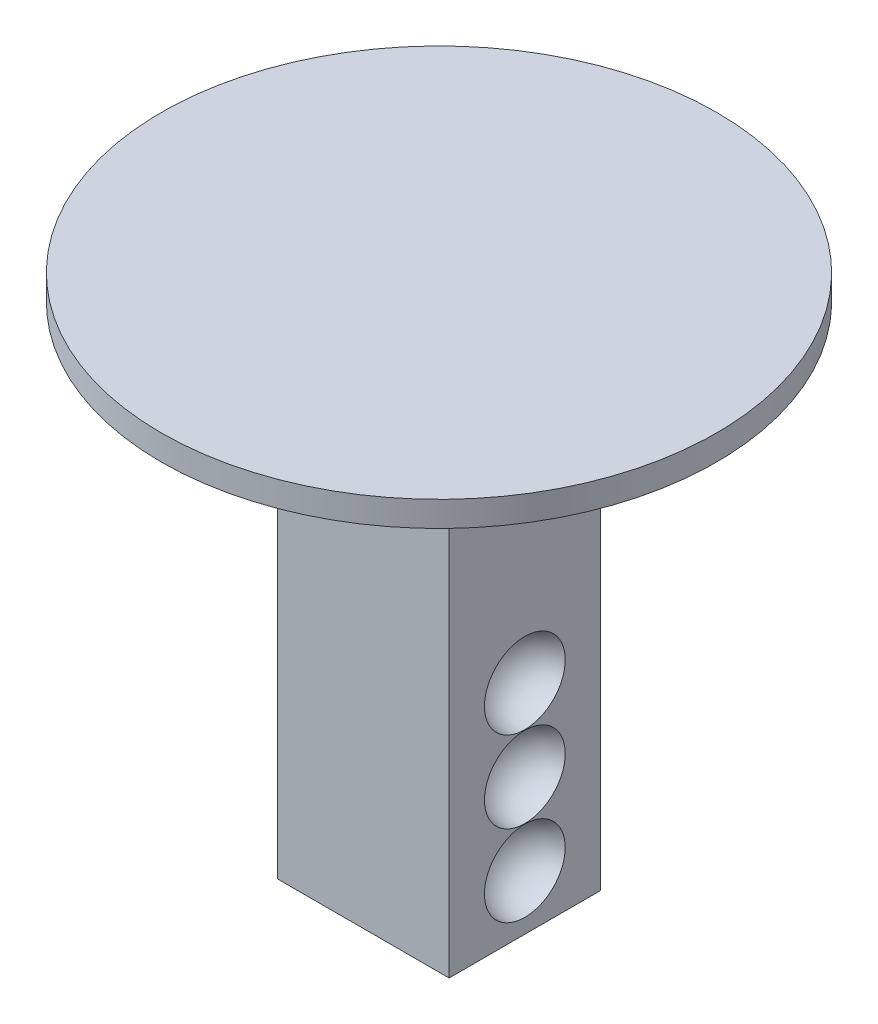
ISO-10303-21;
HEADER;
FILE_DESCRIPTION(('STEP AP214'),'2;1');
FILE_NAME('part.step','',(''),(''),'','','');
FILE_SCHEMA(('AUTOMOTIVE_DESIGN { 1 0 10303 214 1 1 1 1 }'));
ENDSEC;
DATA;
#1=APPLICATION_CONTEXT('core data for automotive mechanical design processes');
#2=APPLICATION_PROTOCOL_DEFINITION('international standard','automotive_design',2000,#1);
#3=PRODUCT_CONTEXT('',#1,'mechanical');
#4=PRODUCT('Part','Part','',(#3));
#5=PRODUCT_RELATED_PRODUCT_CATEGORY('part','',(#4));
#6=PRODUCT_DEFINITION_FORMATION('','',#4);
#7=PRODUCT_DEFINITION_CONTEXT('part definition',#1,'design');
#8=PRODUCT_DEFINITION('design','',#6,#7);
#9=PRODUCT_DEFINITION_SHAPE('','',#8);
#10=(LENGTH_UNIT() NAMED_UNIT(*) SI_UNIT(.MILLI.,.METRE.));
#11=(NAMED_UNIT(*) PLANE_ANGLE_UNIT() SI_UNIT($,.RADIAN.));
#12=(NAMED_UNIT(*) SI_UNIT($,.STERADIAN.) SOLID_ANGLE_UNIT());
#13=UNCERTAINTY_MEASURE_WITH_UNIT(LENGTH_MEASURE(1.E-05),#10,'distance_accuracy_value','');
#14=(GEOMETRIC_REPRESENTATION_CONTEXT(3) GLOBAL_UNCERTAINTY_ASSIGNED_CONTEXT((#13)) GLOBAL_UNIT_ASSIGNED_CONTEXT((#10,
#11,#12)) REPRESENTATION_CONTEXT('',''));
#15=CARTESIAN_POINT('',(0.,0.,0.));
#16=DIRECTION('',(0.,0.,1.));
#17=DIRECTION('',(1.,0.,0.));
#18=AXIS2_PLACEMENT_3D('',#15,#16,#17);
#19=CARTESIAN_POINT('',(-17.,70.,-15.));
#20=DIRECTION('',(-1.,0.,0.));
#21=DIRECTION('',(0.,-1.,0.));
#22=AXIS2_PLACEMENT_3D('',#19,#20,#21);
#23=PLANE('',#22);
#24=CARTESIAN_POINT('',(-17.,13.1,0.));
#25=DIRECTION('',(-1.,0.,0.));
#26=DIRECTION('',(0.,-1.,0.));
#27=AXIS2_PLACEMENT_3D('',#24,#25,#26);
#28=CIRCLE('',#27,8.);
#29=CARTESIAN_POINT('',(-17.,5.1,0.));
#30=VERTEX_POINT('',#29);
#31=EDGE_CURVE('E127',#30,#30,#28,.F.);
#32=ORIENTED_EDGE('',*,*,#31,.T.);
#33=EDGE_LOOP('',(#32));
#34=FACE_BOUND('',#33,.T.);
#35=CARTESIAN_POINT('',(-17.,-19.1,0.));
#36=DIRECTION('',(-1.,0.,0.));
#37=DIRECTION('',(0.,-1.,0.));
#38=AXIS2_PLACEMENT_3D('',#35,#36,#37);
#39=CIRCLE('',#38,8.);
#40=CARTESIAN_POINT('',(-17.,-27.1,0.));
#41=VERTEX_POINT('',#40);
#42=EDGE_CURVE('E123',#41,#41,#39,.F.);
#43=ORIENTED_EDGE('',*,*,#42,.T.);
#44=EDGE_LOOP('',(#43));
#45=FACE_BOUND('',#44,.T.);
#46=CARTESIAN_POINT('',(-17.,-3.,0.));
#47=DIRECTION('',(-1.,0.,0.));
#48=DIRECTION('',(0.,-1.,0.));
#49=AXIS2_PLACEMENT_3D('',#46,#47,#48);
#50=CIRCLE('',#49,8.);
#51=CARTESIAN_POINT('',(-17.,-11.,0.));
#52=VERTEX_POINT('',#51);
#53=EDGE_CURVE('E119',#52,#52,#50,.F.);
#54=ORIENTED_EDGE('',*,*,#53,.T.);
#55=EDGE_LOOP('',(#54));
#56=FACE_BOUND('',#55,.T.);
#57=DIRECTION('',(0.,0.,1.));
#58=VECTOR('',#57,1.);
#59=CARTESIAN_POINT('',(-17.,-30.,-15.));
#60=LINE('',#59,#58);
#61=CARTESIAN_POINT('',(-17.,-30.,-15.));
#62=VERTEX_POINT('',#61);
#63=CARTESIAN_POINT('',(-17.,-30.,15.));
#64=VERTEX_POINT('',#63);
#65=EDGE_CURVE('E58',#62,#64,#60,.T.);
#66=ORIENTED_EDGE('',*,*,#65,.T.);
#67=DIRECTION('',(0.,-1.,0.));
#68=VECTOR('',#67,1.);
#69=CARTESIAN_POINT('',(-17.,70.,15.));
#70=LINE('',#69,#68);
#71=CARTESIAN_POINT('',(-17.,70.,15.));
#72=VERTEX_POINT('',#71);
#73=EDGE_CURVE('E103',#72,#64,#70,.T.);
#74=ORIENTED_EDGE('',*,*,#73,.F.);
#75=DIRECTION('',(0.,0.,1.));
#76=VECTOR('',#75,1.);
#77=CARTESIAN_POINT('',(-17.,70.,-15.));
#78=LINE('',#77,#76);
#79=CARTESIAN_POINT('',(-17.,70.,-15.));
#80=VERTEX_POINT('',#79);
#81=EDGE_CURVE('E11',#80,#72,#78,.T.);
#82=ORIENTED_EDGE('',*,*,#81,.F.);
#83=DIRECTION('',(0.,-1.,0.));
#84=VECTOR('',#83,1.);
#85=CARTESIAN_POINT('',(-17.,70.,-15.));
#86=LINE('',#85,#84);
#87=EDGE_CURVE('E92',#80,#62,#86,.T.);
#88=ORIENTED_EDGE('',*,*,#87,.T.);
#89=EDGE_LOOP('',(#66,#74,#82,#88));
#90=FACE_BOUND('',#89,.T.);
#91=ADVANCED_FACE('F49',(#34,#45,#56,#90),#23,.T.);
#92=CARTESIAN_POINT('',(-17.,-30.,-15.));
#93=DIRECTION('',(0.,-1.,0.));
#94=DIRECTION('',(0.,0.,-1.));
#95=AXIS2_PLACEMENT_3D('',#92,#93,#94);
#96=PLANE('',#95);
#97=CARTESIAN_POINT('',(0.,-30.,0.));
#98=DIRECTION('',(0.,1.,0.));
#99=DIRECTION('',(-1.,0.,0.));
#100=AXIS2_PLACEMENT_3D('',#97,#98,#99);
#101=CIRCLE('',#100,8.);
#102=CARTESIAN_POINT('',(-8.,-30.,0.));
#103=VERTEX_POINT('',#102);
#104=EDGE_CURVE('E146',#103,#103,#101,.T.);
#105=ORIENTED_EDGE('',*,*,#104,.T.);
#106=EDGE_LOOP('',(#105));
#107=FACE_BOUND('',#106,.T.);
#108=DIRECTION('',(1.,0.,0.));
#109=VECTOR('',#108,1.);
#110=CARTESIAN_POINT('',(-17.,-30.,-15.));
#111=LINE('',#110,#109);
#112=CARTESIAN_POINT('',(17.,-30.,-15.));
#113=VERTEX_POINT('',#112);
#114=EDGE_CURVE('E99',#62,#113,#111,.T.);
#115=ORIENTED_EDGE('',*,*,#114,.T.);
#116=DIRECTION('',(0.,0.,1.));
#117=VECTOR('',#116,1.);
#118=CARTESIAN_POINT('',(17.,-30.,-15.));
#119=LINE('',#118,#117);
#120=CARTESIAN_POINT('',(17.,-30.,15.));
#121=VERTEX_POINT('',#120);
#122=EDGE_CURVE('E131',#113,#121,#119,.T.);
#123=ORIENTED_EDGE('',*,*,#122,.T.);
#124=DIRECTION('',(1.,0.,0.));
#125=VECTOR('',#124,1.);
#126=CARTESIAN_POINT('',(-17.,-30.,15.));
#127=LINE('',#126,#125);
#128=EDGE_CURVE('E174',#64,#121,#127,.T.);
#129=ORIENTED_EDGE('',*,*,#128,.F.);
#130=ORIENTED_EDGE('',*,*,#65,.F.);
#131=EDGE_LOOP('',(#115,#123,#129,#130));
#132=FACE_BOUND('',#131,.T.);
#133=ADVANCED_FACE('F215',(#107,#132),#96,.T.);
#134=CARTESIAN_POINT('',(0.,0.,-15.));
#135=DIRECTION('',(0.,0.,1.));
#136=DIRECTION('',(1.,0.,0.));
#137=AXIS2_PLACEMENT_3D('',#134,#135,#136);
#138=PLANE('',#137);
#139=ORIENTED_EDGE('',*,*,#87,.F.);
#140=DIRECTION('',(-1.,0.,0.));
#141=VECTOR('',#140,1.);
#142=CARTESIAN_POINT('',(-17.,70.,-15.));
#143=LINE('',#142,#141);
#144=CARTESIAN_POINT('',(17.,70.,-15.));
#145=VERTEX_POINT('',#144);
#146=EDGE_CURVE('E97',#145,#80,#143,.T.);
#147=ORIENTED_EDGE('',*,*,#146,.F.);
#148=DIRECTION('',(0.,-1.,0.));
#149=VECTOR('',#148,1.);
#150=CARTESIAN_POINT('',(17.,70.,-15.));
#151=LINE('',#150,#149);
#152=EDGE_CURVE('E166',#145,#113,#151,.T.);
#153=ORIENTED_EDGE('',*,*,#152,.T.);
#154=ORIENTED_EDGE('',*,*,#114,.F.);
#155=EDGE_LOOP('',(#139,#147,#153,#154));
#156=FACE_BOUND('',#155,.T.);
#157=ADVANCED_FACE('F94',(#156),#138,.F.);
#158=CARTESIAN_POINT('',(0.,0.,15.));
#159=DIRECTION('',(0.,0.,1.));
#160=DIRECTION('',(1.,0.,0.));
#161=AXIS2_PLACEMENT_3D('',#158,#159,#160);
#162=PLANE('',#161);
#163=ORIENTED_EDGE('',*,*,#73,.T.);
#164=ORIENTED_EDGE('',*,*,#128,.T.);
#165=DIRECTION('',(0.,-1.,0.));
#166=VECTOR('',#165,1.);
#167=CARTESIAN_POINT('',(17.,70.,15.));
#168=LINE('',#167,#166);
#169=CARTESIAN_POINT('',(17.,70.,15.));
#170=VERTEX_POINT('',#169);
#171=EDGE_CURVE('E135',#170,#121,#168,.T.);
#172=ORIENTED_EDGE('',*,*,#171,.F.);
#173=DIRECTION('',(-1.,0.,0.));
#174=VECTOR('',#173,1.);
#175=CARTESIAN_POINT('',(-17.,70.,15.));
#176=LINE('',#175,#174);
#177=EDGE_CURVE('E73',#170,#72,#176,.T.);
#178=ORIENTED_EDGE('',*,*,#177,.T.);
#179=EDGE_LOOP('',(#163,#164,#172,#178));
#180=FACE_BOUND('',#179,.T.);
#181=ADVANCED_FACE('F228',(#180),#162,.T.);
#182=CARTESIAN_POINT('',(-17.,-3.,0.));
#183=DIRECTION('',(0.,1.,0.));
#184=DIRECTION('',(1.,0.,0.));
#185=AXIS2_PLACEMENT_3D('',#182,#183,#184);
#186=SPHERICAL_SURFACE('',#185,8.);
#187=CARTESIAN_POINT('',(-17.,-3.,0.));
#188=DIRECTION('',(-1.,0.,0.));
#189=DIRECTION('',(0.,-1.,0.));
#190=AXIS2_PLACEMENT_3D('',#187,#188,#189);
#191=SPHERICAL_SURFACE('',#190,8.);
#192=ORIENTED_EDGE('',*,*,#53,.F.);
#193=EDGE_LOOP('',(#192));
#194=FACE_BOUND('',#193,.T.);
#195=ADVANCED_FACE('F225',(#194),#191,.F.);
#196=CARTESIAN_POINT('',(-17.,-19.1,0.));
#197=DIRECTION('',(0.,1.,0.));
#198=DIRECTION('',(1.,0.,0.));
#199=AXIS2_PLACEMENT_3D('',#196,#197,#198);
#200=SPHERICAL_SURFACE('',#199,8.);
#201=CARTESIAN_POINT('',(-17.,-19.1,0.));
#202=DIRECTION('',(-1.,0.,0.));
#203=DIRECTION('',(0.,-1.,0.));
#204=AXIS2_PLACEMENT_3D('',#201,#202,#203);
#205=SPHERICAL_SURFACE('',#204,8.);
#206=ORIENTED_EDGE('',*,*,#42,.F.);
#207=EDGE_LOOP('',(#206));
#208=FACE_BOUND('',#207,.T.);
#209=ADVANCED_FACE('F227',(#208),#205,.F.);
#210=CARTESIAN_POINT('',(-17.,13.1,0.));
#211=DIRECTION('',(0.,1.,0.));
#212=DIRECTION('',(1.,0.,0.));
#213=AXIS2_PLACEMENT_3D('',#210,#211,#212);
#214=SPHERICAL_SURFACE('',#213,8.);
#215=CARTESIAN_POINT('',(-17.,13.1,0.));
#216=DIRECTION('',(-1.,0.,0.));
#217=DIRECTION('',(0.,-1.,0.));
#218=AXIS2_PLACEMENT_3D('',#215,#216,#217);
#219=SPHERICAL_SURFACE('',#218,8.);
#220=ORIENTED_EDGE('',*,*,#31,.F.);
#221=EDGE_LOOP('',(#220));
#222=FACE_BOUND('',#221,.T.);
#223=ADVANCED_FACE('F233',(#222),#219,.F.);
#224=CARTESIAN_POINT('',(17.,70.,-15.));
#225=DIRECTION('',(-1.,0.,0.));
#226=DIRECTION('',(0.,-1.,0.));
#227=AXIS2_PLACEMENT_3D('',#224,#225,#226);
#228=PLANE('',#227);
#229=CARTESIAN_POINT('',(17.,13.1,0.));
#230=DIRECTION('',(-1.,0.,0.));
#231=DIRECTION('',(0.,-1.,0.));
#232=AXIS2_PLACEMENT_3D('',#229,#230,#231);
#233=CIRCLE('',#232,8.);
#234=CARTESIAN_POINT('',(17.,5.1,0.));
#235=VERTEX_POINT('',#234);
#236=EDGE_CURVE('E52',#235,#235,#233,.F.);
#237=ORIENTED_EDGE('',*,*,#236,.F.);
#238=EDGE_LOOP('',(#237));
#239=FACE_BOUND('',#238,.T.);
#240=CARTESIAN_POINT('',(17.,-19.1,0.));
#241=DIRECTION('',(-1.,0.,0.));
#242=DIRECTION('',(0.,-1.,0.));
#243=AXIS2_PLACEMENT_3D('',#240,#241,#242);
#244=CIRCLE('',#243,8.);
#245=CARTESIAN_POINT('',(17.,-27.1,0.));
#246=VERTEX_POINT('',#245);
#247=EDGE_CURVE('E136',#246,#246,#244,.F.);
#248=ORIENTED_EDGE('',*,*,#247,.F.);
#249=EDGE_LOOP('',(#248));
#250=FACE_BOUND('',#249,.T.);
#251=CARTESIAN_POINT('',(17.,-3.,0.));
#252=DIRECTION('',(-1.,0.,0.));
#253=DIRECTION('',(0.,-1.,0.));
#254=AXIS2_PLACEMENT_3D('',#251,#252,#253);
#255=CIRCLE('',#254,8.);
#256=CARTESIAN_POINT('',(17.,-11.,0.));
#257=VERTEX_POINT('',#256);
#258=EDGE_CURVE('E132',#257,#257,#255,.F.);
#259=ORIENTED_EDGE('',*,*,#258,.F.);
#260=EDGE_LOOP('',(#259));
#261=FACE_BOUND('',#260,.T.);
#262=DIRECTION('',(0.,0.,1.));
#263=VECTOR('',#262,1.);
#264=CARTESIAN_POINT('',(17.,70.,-15.));
#265=LINE('',#264,#263);
#266=EDGE_CURVE('E108',#145,#170,#265,.T.);
#267=ORIENTED_EDGE('',*,*,#266,.T.);
#268=ORIENTED_EDGE('',*,*,#171,.T.);
#269=ORIENTED_EDGE('',*,*,#122,.F.);
#270=ORIENTED_EDGE('',*,*,#152,.F.);
#271=EDGE_LOOP('',(#267,#268,#269,#270));
#272=FACE_BOUND('',#271,.T.);
#273=ADVANCED_FACE('F252',(#239,#250,#261,#272),#228,.F.);
#274=CARTESIAN_POINT('',(17.,-3.,0.));
#275=DIRECTION('',(0.,1.,0.));
#276=DIRECTION('',(-1.,0.,0.));
#277=AXIS2_PLACEMENT_3D('',#274,#275,#276);
#278=SPHERICAL_SURFACE('',#277,8.);
#279=CARTESIAN_POINT('',(17.,-3.,0.));
#280=DIRECTION('',(-1.,0.,0.));
#281=DIRECTION('',(0.,-1.,0.));
#282=AXIS2_PLACEMENT_3D('',#279,#280,#281);
#283=SPHERICAL_SURFACE('',#282,8.);
#284=ORIENTED_EDGE('',*,*,#258,.T.);
#285=EDGE_LOOP('',(#284));
#286=FACE_BOUND('',#285,.T.);
#287=ADVANCED_FACE('F256',(#286),#283,.F.);
#288=CARTESIAN_POINT('',(17.,-19.1,0.));
#289=DIRECTION('',(0.,1.,0.));
#290=DIRECTION('',(-1.,0.,0.));
#291=AXIS2_PLACEMENT_3D('',#288,#289,#290);
#292=SPHERICAL_SURFACE('',#291,8.);
#293=CARTESIAN_POINT('',(17.,-19.1,0.));
#294=DIRECTION('',(-1.,0.,0.));
#295=DIRECTION('',(0.,-1.,0.));
#296=AXIS2_PLACEMENT_3D('',#293,#294,#295);
#297=SPHERICAL_SURFACE('',#296,8.);
#298=ORIENTED_EDGE('',*,*,#247,.T.);
#299=EDGE_LOOP('',(#298));
#300=FACE_BOUND('',#299,.T.);
#301=ADVANCED_FACE('F309',(#300),#297,.F.);
#302=CARTESIAN_POINT('',(17.,13.1,0.));
#303=DIRECTION('',(0.,1.,0.));
#304=DIRECTION('',(-1.,0.,0.));
#305=AXIS2_PLACEMENT_3D('',#302,#303,#304);
#306=SPHERICAL_SURFACE('',#305,8.);
#307=CARTESIAN_POINT('',(17.,13.1,0.));
#308=DIRECTION('',(-1.,0.,0.));
#309=DIRECTION('',(0.,-1.,0.));
#310=AXIS2_PLACEMENT_3D('',#307,#308,#309);
#311=SPHERICAL_SURFACE('',#310,8.);
#312=ORIENTED_EDGE('',*,*,#236,.T.);
#313=EDGE_LOOP('',(#312));
#314=FACE_BOUND('',#313,.T.);
#315=ADVANCED_FACE('F299',(#314),#311,.F.);
#316=CARTESIAN_POINT('',(0.,-8.,0.));
#317=DIRECTION('',(0.,1.,0.));
#318=DIRECTION('',(-1.,0.,0.));
#319=AXIS2_PLACEMENT_3D('',#316,#317,#318);
#320=CYLINDRICAL_SURFACE('',#319,8.);
#321=ORIENTED_EDGE('',*,*,#104,.F.);
#322=EDGE_LOOP('',(#321));
#323=FACE_BOUND('',#322,.T.);
#324=CARTESIAN_POINT('',(0.,-8.,0.));
#325=DIRECTION('',(0.,1.,0.));
#326=DIRECTION('',(-1.,0.,0.));
#327=AXIS2_PLACEMENT_3D('',#324,#325,#326);
#328=CIRCLE('',#327,8.);
#329=CARTESIAN_POINT('',(-8.,-8.,0.));
#330=VERTEX_POINT('',#329);
#331=EDGE_CURVE('E152',#330,#330,#328,.T.);
#332=ORIENTED_EDGE('',*,*,#331,.T.);
#333=EDGE_LOOP('',(#332));
#334=FACE_BOUND('',#333,.T.);
#335=ADVANCED_FACE('F289',(#323,#334),#320,.F.);
#336=CARTESIAN_POINT('',(-8.,-8.,0.));
#337=DIRECTION('',(0.,1.,0.));
#338=DIRECTION('',(-1.,0.,0.));
#339=AXIS2_PLACEMENT_3D('',#336,#337,#338);
#340=PLANE('',#339);
#341=ORIENTED_EDGE('',*,*,#331,.F.);
#342=EDGE_LOOP('',(#341));
#343=FACE_BOUND('',#342,.T.);
#344=ADVANCED_FACE('F211',(#343),#340,.F.);
#345=CARTESIAN_POINT('',(0.,75.,0.));
#346=DIRECTION('',(0.,1.,0.));
#347=DIRECTION('',(0.,0.,1.));
#348=AXIS2_PLACEMENT_3D('',#345,#346,#347);
#349=PLANE('',#348);
#350=CARTESIAN_POINT('',(0.,75.,0.));
#351=DIRECTION('',(0.,-1.,0.));
#352=DIRECTION('',(0.,0.,-1.));
#353=AXIS2_PLACEMENT_3D('',#350,#351,#352);
#354=CIRCLE('',#353,55.);
#355=CARTESIAN_POINT('',(0.,75.,-55.));
#356=VERTEX_POINT('',#355);
#357=EDGE_CURVE('E160',#356,#356,#354,.T.);
#358=ORIENTED_EDGE('',*,*,#357,.F.);
#359=EDGE_LOOP('',(#358));
#360=FACE_BOUND('',#359,.T.);
#361=ADVANCED_FACE('F204',(#360),#349,.T.);
#362=CARTESIAN_POINT('',(0.,70.,0.));
#363=DIRECTION('',(0.,-1.,0.));
#364=DIRECTION('',(0.,0.,-1.));
#365=AXIS2_PLACEMENT_3D('',#362,#363,#364);
#366=CYLINDRICAL_SURFACE('',#365,55.);
#367=ORIENTED_EDGE('',*,*,#357,.T.);
#368=EDGE_LOOP('',(#367));
#369=FACE_BOUND('',#368,.T.);
#370=CARTESIAN_POINT('',(0.,70.,0.));
#371=DIRECTION('',(0.,-1.,0.));
#372=DIRECTION('',(0.,0.,-1.));
#373=AXIS2_PLACEMENT_3D('',#370,#371,#372);
#374=CIRCLE('',#373,55.);
#375=CARTESIAN_POINT('',(0.,70.,-55.));
#376=VERTEX_POINT('',#375);
#377=EDGE_CURVE('E191',#376,#376,#374,.T.);
#378=ORIENTED_EDGE('',*,*,#377,.F.);
#379=EDGE_LOOP('',(#378));
#380=FACE_BOUND('',#379,.T.);
#381=ADVANCED_FACE('F202',(#369,#380),#366,.T.);
#382=CARTESIAN_POINT('',(0.,70.,0.));
#383=DIRECTION('',(0.,-1.,0.));
#384=DIRECTION('',(0.,0.,-1.));
#385=AXIS2_PLACEMENT_3D('',#382,#383,#384);
#386=PLANE('',#385);
#387=ORIENTED_EDGE('',*,*,#146,.T.);
#388=ORIENTED_EDGE('',*,*,#81,.T.);
#389=ORIENTED_EDGE('',*,*,#177,.F.);
#390=ORIENTED_EDGE('',*,*,#266,.F.);
#391=EDGE_LOOP('',(#387,#388,#389,#390));
#392=FACE_BOUND('',#391,.T.);
#393=ORIENTED_EDGE('',*,*,#377,.T.);
#394=EDGE_LOOP('',(#393));
#395=FACE_BOUND('',#394,.T.);
#396=ADVANCED_FACE('F106',(#392,#395),#386,.T.);
#397=CLOSED_SHELL('',(#91,#133,#157,#181,#195,#209,#223,#273,#287,#301,#315,#335,#344,#361,#381,#396));
#398=MANIFOLD_SOLID_BREP('B2',#397);
#399=ADVANCED_BREP_SHAPE_REPRESENTATION('',(#18,#398),#14);
#400=SHAPE_DEFINITION_REPRESENTATION(#9,#399);
ENDSEC;
END-ISO-10303-21;
